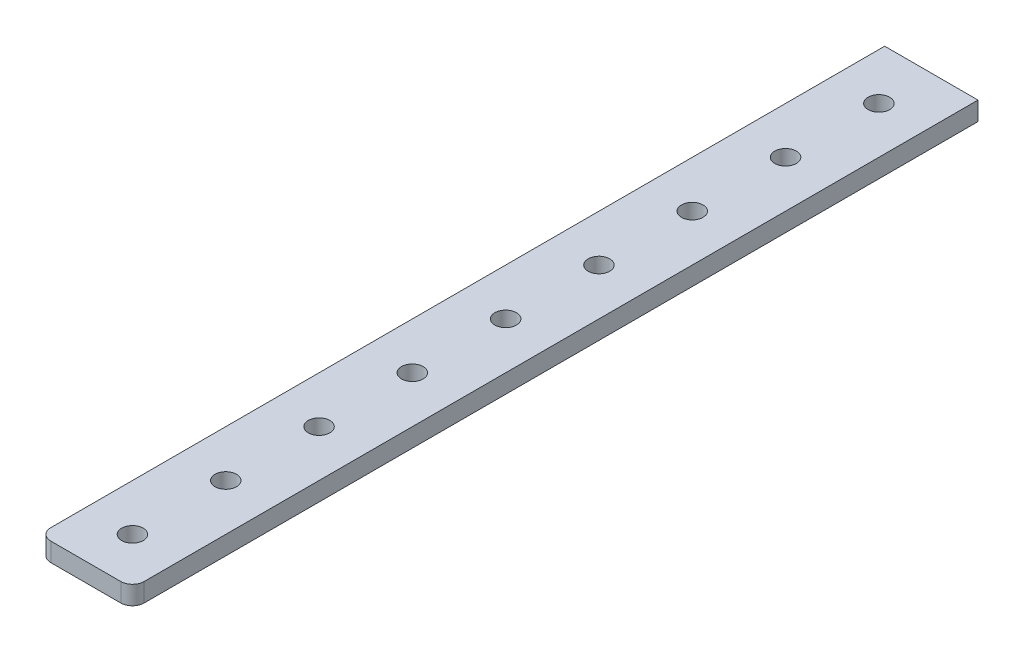
ISO-10303-21;
HEADER;
FILE_DESCRIPTION(('STEP AP214'),'2;1');
FILE_NAME('part.step','',(''),(''),'','','');
FILE_SCHEMA(('AUTOMOTIVE_DESIGN { 1 0 10303 214 1 1 1 1 }'));
ENDSEC;
DATA;
#1=APPLICATION_CONTEXT('core data for automotive mechanical design processes');
#2=APPLICATION_PROTOCOL_DEFINITION('international standard','automotive_design',2000,#1);
#3=PRODUCT_CONTEXT('',#1,'mechanical');
#4=PRODUCT('Part','Part','',(#3));
#5=PRODUCT_RELATED_PRODUCT_CATEGORY('part','',(#4));
#6=PRODUCT_DEFINITION_FORMATION('','',#4);
#7=PRODUCT_DEFINITION_CONTEXT('part definition',#1,'design');
#8=PRODUCT_DEFINITION('design','',#6,#7);
#9=PRODUCT_DEFINITION_SHAPE('','',#8);
#10=(LENGTH_UNIT() NAMED_UNIT(*) SI_UNIT(.MILLI.,.METRE.));
#11=(NAMED_UNIT(*) PLANE_ANGLE_UNIT() SI_UNIT($,.RADIAN.));
#12=(NAMED_UNIT(*) SI_UNIT($,.STERADIAN.) SOLID_ANGLE_UNIT());
#13=UNCERTAINTY_MEASURE_WITH_UNIT(LENGTH_MEASURE(1.E-05),#10,'distance_accuracy_value','');
#14=(GEOMETRIC_REPRESENTATION_CONTEXT(3) GLOBAL_UNCERTAINTY_ASSIGNED_CONTEXT((#13)) GLOBAL_UNIT_ASSIGNED_CONTEXT((#10,
#11,#12)) REPRESENTATION_CONTEXT('',''));
#15=CARTESIAN_POINT('',(0.,0.,0.));
#16=DIRECTION('',(0.,0.,1.));
#17=DIRECTION('',(1.,0.,0.));
#18=AXIS2_PLACEMENT_3D('',#15,#16,#17);
#19=CARTESIAN_POINT('',(0.,0.,0.));
#20=DIRECTION('',(0.,0.,1.));
#21=DIRECTION('',(1.,0.,0.));
#22=AXIS2_PLACEMENT_3D('',#19,#20,#21);
#23=PLANE('',#22);
#24=DIRECTION('',(1.,0.,0.));
#25=VECTOR('',#24,1.);
#26=CARTESIAN_POINT('',(-6.,0.,0.));
#27=LINE('',#26,#25);
#28=CARTESIAN_POINT('',(-6.,0.,0.));
#29=VERTEX_POINT('',#28);
#30=CARTESIAN_POINT('',(6.,0.,0.));
#31=VERTEX_POINT('',#30);
#32=EDGE_CURVE('E47',#29,#31,#27,.T.);
#33=ORIENTED_EDGE('',*,*,#32,.T.);
#34=DIRECTION('',(0.,1.,0.));
#35=VECTOR('',#34,1.);
#36=CARTESIAN_POINT('',(6.,0.,0.));
#37=LINE('',#36,#35);
#38=CARTESIAN_POINT('',(6.,3.2,0.));
#39=VERTEX_POINT('',#38);
#40=EDGE_CURVE('E62',#31,#39,#37,.T.);
#41=ORIENTED_EDGE('',*,*,#40,.T.);
#42=DIRECTION('',(-1.,0.,0.));
#43=VECTOR('',#42,1.);
#44=CARTESIAN_POINT('',(6.,3.2,0.));
#45=LINE('',#44,#43);
#46=CARTESIAN_POINT('',(-6.,3.2,0.));
#47=VERTEX_POINT('',#46);
#48=EDGE_CURVE('E152',#39,#47,#45,.T.);
#49=ORIENTED_EDGE('',*,*,#48,.T.);
#50=DIRECTION('',(0.,-1.,0.));
#51=VECTOR('',#50,1.);
#52=CARTESIAN_POINT('',(-6.,3.2,0.));
#53=LINE('',#52,#51);
#54=EDGE_CURVE('E158',#47,#29,#53,.T.);
#55=ORIENTED_EDGE('',*,*,#54,.T.);
#56=EDGE_LOOP('',(#33,#41,#49,#55));
#57=FACE_BOUND('',#56,.T.);
#58=ADVANCED_FACE('F39',(#57),#23,.T.);
#59=CARTESIAN_POINT('',(-8.,0.,0.));
#60=DIRECTION('',(0.,-1.,0.));
#61=DIRECTION('',(0.,0.,-1.));
#62=AXIS2_PLACEMENT_3D('',#59,#60,#61);
#63=PLANE('',#62);
#64=DIRECTION('',(1.,0.,0.));
#65=VECTOR('',#64,1.);
#66=CARTESIAN_POINT('',(0.,0.,-145.));
#67=LINE('',#66,#65);
#68=CARTESIAN_POINT('',(-8.,0.,-145.));
#69=VERTEX_POINT('',#68);
#70=CARTESIAN_POINT('',(8.,0.,-145.));
#71=VERTEX_POINT('',#70);
#72=EDGE_CURVE('E53',#69,#71,#67,.T.);
#73=ORIENTED_EDGE('',*,*,#72,.T.);
#74=DIRECTION('',(0.,0.,-1.));
#75=VECTOR('',#74,1.);
#76=CARTESIAN_POINT('',(8.,0.,-2.));
#77=LINE('',#76,#75);
#78=CARTESIAN_POINT('',(8.,0.,-2.));
#79=VERTEX_POINT('',#78);
#80=EDGE_CURVE('E206',#79,#71,#77,.T.);
#81=ORIENTED_EDGE('',*,*,#80,.F.);
#82=CARTESIAN_POINT('',(6.,0.,-2.));
#83=DIRECTION('',(0.,-1.,0.));
#84=DIRECTION('',(1.,0.,0.));
#85=AXIS2_PLACEMENT_3D('',#82,#83,#84);
#86=CIRCLE('',#85,2.);
#87=EDGE_CURVE('E160',#79,#31,#86,.T.);
#88=ORIENTED_EDGE('',*,*,#87,.T.);
#89=ORIENTED_EDGE('',*,*,#32,.F.);
#90=CARTESIAN_POINT('',(-6.,0.,-2.));
#91=DIRECTION('',(0.,-1.,0.));
#92=DIRECTION('',(0.,0.,1.));
#93=AXIS2_PLACEMENT_3D('',#90,#91,#92);
#94=CIRCLE('',#93,2.);
#95=CARTESIAN_POINT('',(-8.,0.,-2.));
#96=VERTEX_POINT('',#95);
#97=EDGE_CURVE('E167',#29,#96,#94,.T.);
#98=ORIENTED_EDGE('',*,*,#97,.T.);
#99=DIRECTION('',(0.,0.,-1.));
#100=VECTOR('',#99,1.);
#101=CARTESIAN_POINT('',(-8.,0.,-2.));
#102=LINE('',#101,#100);
#103=EDGE_CURVE('E209',#96,#69,#102,.T.);
#104=ORIENTED_EDGE('',*,*,#103,.T.);
#105=EDGE_LOOP('',(#73,#81,#88,#89,#98,#104));
#106=FACE_BOUND('',#105,.T.);
#107=CARTESIAN_POINT('',(0.,0.,-8.));
#108=DIRECTION('',(0.,-1.,0.));
#109=DIRECTION('',(1.,0.,0.));
#110=AXIS2_PLACEMENT_3D('',#107,#108,#109);
#111=CIRCLE('',#110,1.85);
#112=CARTESIAN_POINT('',(-1.85,0.,-8.));
#113=VERTEX_POINT('',#112);
#114=EDGE_CURVE('E150',#113,#113,#111,.T.);
#115=ORIENTED_EDGE('',*,*,#114,.F.);
#116=EDGE_LOOP('',(#115));
#117=FACE_BOUND('',#116,.T.);
#118=CARTESIAN_POINT('',(0.,0.,-24.));
#119=DIRECTION('',(0.,-1.,0.));
#120=DIRECTION('',(1.,0.,0.));
#121=AXIS2_PLACEMENT_3D('',#118,#119,#120);
#122=CIRCLE('',#121,1.85);
#123=CARTESIAN_POINT('',(-1.85,0.,-24.));
#124=VERTEX_POINT('',#123);
#125=EDGE_CURVE('E177',#124,#124,#122,.T.);
#126=ORIENTED_EDGE('',*,*,#125,.F.);
#127=EDGE_LOOP('',(#126));
#128=FACE_BOUND('',#127,.T.);
#129=CARTESIAN_POINT('',(0.,0.,-40.));
#130=DIRECTION('',(0.,-1.,0.));
#131=DIRECTION('',(1.,0.,0.));
#132=AXIS2_PLACEMENT_3D('',#129,#130,#131);
#133=CIRCLE('',#132,1.85);
#134=CARTESIAN_POINT('',(-1.85,0.,-40.));
#135=VERTEX_POINT('',#134);
#136=EDGE_CURVE('E164',#135,#135,#133,.T.);
#137=ORIENTED_EDGE('',*,*,#136,.F.);
#138=EDGE_LOOP('',(#137));
#139=FACE_BOUND('',#138,.T.);
#140=CARTESIAN_POINT('',(0.,0.,-56.));
#141=DIRECTION('',(0.,-1.,0.));
#142=DIRECTION('',(1.,0.,0.));
#143=AXIS2_PLACEMENT_3D('',#140,#141,#142);
#144=CIRCLE('',#143,1.85);
#145=CARTESIAN_POINT('',(-1.85,0.,-56.));
#146=VERTEX_POINT('',#145);
#147=EDGE_CURVE('E161',#146,#146,#144,.T.);
#148=ORIENTED_EDGE('',*,*,#147,.F.);
#149=EDGE_LOOP('',(#148));
#150=FACE_BOUND('',#149,.T.);
#151=CARTESIAN_POINT('',(0.,0.,-72.));
#152=DIRECTION('',(0.,-1.,0.));
#153=DIRECTION('',(1.,0.,0.));
#154=AXIS2_PLACEMENT_3D('',#151,#152,#153);
#155=CIRCLE('',#154,1.85);
#156=CARTESIAN_POINT('',(-1.85,0.,-72.));
#157=VERTEX_POINT('',#156);
#158=EDGE_CURVE('E156',#157,#157,#155,.T.);
#159=ORIENTED_EDGE('',*,*,#158,.F.);
#160=EDGE_LOOP('',(#159));
#161=FACE_BOUND('',#160,.T.);
#162=CARTESIAN_POINT('',(0.,0.,-88.));
#163=DIRECTION('',(0.,-1.,0.));
#164=DIRECTION('',(1.,0.,0.));
#165=AXIS2_PLACEMENT_3D('',#162,#163,#164);
#166=CIRCLE('',#165,1.85);
#167=CARTESIAN_POINT('',(-1.85,0.,-88.));
#168=VERTEX_POINT('',#167);
#169=EDGE_CURVE('E153',#168,#168,#166,.T.);
#170=ORIENTED_EDGE('',*,*,#169,.F.);
#171=EDGE_LOOP('',(#170));
#172=FACE_BOUND('',#171,.T.);
#173=CARTESIAN_POINT('',(0.,0.,-104.));
#174=DIRECTION('',(0.,-1.,0.));
#175=DIRECTION('',(1.,0.,0.));
#176=AXIS2_PLACEMENT_3D('',#173,#174,#175);
#177=CIRCLE('',#176,1.85);
#178=CARTESIAN_POINT('',(-1.85,0.,-104.));
#179=VERTEX_POINT('',#178);
#180=EDGE_CURVE('E157',#179,#179,#177,.T.);
#181=ORIENTED_EDGE('',*,*,#180,.F.);
#182=EDGE_LOOP('',(#181));
#183=FACE_BOUND('',#182,.T.);
#184=CARTESIAN_POINT('',(0.,0.,-120.));
#185=DIRECTION('',(0.,-1.,0.));
#186=DIRECTION('',(1.,0.,0.));
#187=AXIS2_PLACEMENT_3D('',#184,#185,#186);
#188=CIRCLE('',#187,1.85);
#189=CARTESIAN_POINT('',(-1.85,0.,-120.));
#190=VERTEX_POINT('',#189);
#191=EDGE_CURVE('E173',#190,#190,#188,.T.);
#192=ORIENTED_EDGE('',*,*,#191,.F.);
#193=EDGE_LOOP('',(#192));
#194=FACE_BOUND('',#193,.T.);
#195=CARTESIAN_POINT('',(0.,0.,-136.));
#196=DIRECTION('',(0.,-1.,0.));
#197=DIRECTION('',(1.,0.,0.));
#198=AXIS2_PLACEMENT_3D('',#195,#196,#197);
#199=CIRCLE('',#198,1.85);
#200=CARTESIAN_POINT('',(-1.85,0.,-136.));
#201=VERTEX_POINT('',#200);
#202=EDGE_CURVE('E170',#201,#201,#199,.T.);
#203=ORIENTED_EDGE('',*,*,#202,.F.);
#204=EDGE_LOOP('',(#203));
#205=FACE_BOUND('',#204,.T.);
#206=ADVANCED_FACE('F41',(#106,#117,#128,#139,#150,#161,#172,#183,#194,#205),#63,.T.);
#207=CARTESIAN_POINT('',(8.,0.,0.));
#208=DIRECTION('',(1.,0.,0.));
#209=DIRECTION('',(0.,0.,-1.));
#210=AXIS2_PLACEMENT_3D('',#207,#208,#209);
#211=PLANE('',#210);
#212=DIRECTION('',(0.,-1.,0.));
#213=VECTOR('',#212,1.);
#214=CARTESIAN_POINT('',(8.,0.,-145.));
#215=LINE('',#214,#213);
#216=CARTESIAN_POINT('',(8.,3.2,-145.));
#217=VERTEX_POINT('',#216);
#218=EDGE_CURVE('E203',#217,#71,#215,.T.);
#219=ORIENTED_EDGE('',*,*,#218,.F.);
#220=DIRECTION('',(0.,0.,-1.));
#221=VECTOR('',#220,1.);
#222=CARTESIAN_POINT('',(8.,3.2,-2.));
#223=LINE('',#222,#221);
#224=CARTESIAN_POINT('',(8.,3.2,-2.));
#225=VERTEX_POINT('',#224);
#226=EDGE_CURVE('E139',#225,#217,#223,.T.);
#227=ORIENTED_EDGE('',*,*,#226,.F.);
#228=DIRECTION('',(0.,1.,0.));
#229=VECTOR('',#228,1.);
#230=CARTESIAN_POINT('',(8.,0.,-2.));
#231=LINE('',#230,#229);
#232=EDGE_CURVE('E174',#79,#225,#231,.T.);
#233=ORIENTED_EDGE('',*,*,#232,.F.);
#234=ORIENTED_EDGE('',*,*,#80,.T.);
#235=EDGE_LOOP('',(#219,#227,#233,#234));
#236=FACE_BOUND('',#235,.T.);
#237=ADVANCED_FACE('F226',(#236),#211,.T.);
#238=CARTESIAN_POINT('',(8.,3.2,0.));
#239=DIRECTION('',(0.,1.,0.));
#240=DIRECTION('',(0.,0.,1.));
#241=AXIS2_PLACEMENT_3D('',#238,#239,#240);
#242=PLANE('',#241);
#243=DIRECTION('',(1.,0.,0.));
#244=VECTOR('',#243,1.);
#245=CARTESIAN_POINT('',(0.,3.2,-145.));
#246=LINE('',#245,#244);
#247=CARTESIAN_POINT('',(-8.,3.2,-145.));
#248=VERTEX_POINT('',#247);
#249=EDGE_CURVE('E327',#248,#217,#246,.T.);
#250=ORIENTED_EDGE('',*,*,#249,.F.);
#251=DIRECTION('',(0.,0.,-1.));
#252=VECTOR('',#251,1.);
#253=CARTESIAN_POINT('',(-8.,3.2,-2.));
#254=LINE('',#253,#252);
#255=CARTESIAN_POINT('',(-8.,3.2,-2.));
#256=VERTEX_POINT('',#255);
#257=EDGE_CURVE('E190',#256,#248,#254,.T.);
#258=ORIENTED_EDGE('',*,*,#257,.F.);
#259=CARTESIAN_POINT('',(-6.,3.2,-2.));
#260=DIRECTION('',(0.,1.,0.));
#261=DIRECTION('',(-1.,0.,0.));
#262=AXIS2_PLACEMENT_3D('',#259,#260,#261);
#263=CIRCLE('',#262,2.);
#264=EDGE_CURVE('E180',#256,#47,#263,.T.);
#265=ORIENTED_EDGE('',*,*,#264,.T.);
#266=ORIENTED_EDGE('',*,*,#48,.F.);
#267=CARTESIAN_POINT('',(6.,3.2,-2.));
#268=DIRECTION('',(0.,1.,0.));
#269=DIRECTION('',(0.,0.,1.));
#270=AXIS2_PLACEMENT_3D('',#267,#268,#269);
#271=CIRCLE('',#270,2.);
#272=EDGE_CURVE('E143',#39,#225,#271,.T.);
#273=ORIENTED_EDGE('',*,*,#272,.T.);
#274=ORIENTED_EDGE('',*,*,#226,.T.);
#275=EDGE_LOOP('',(#250,#258,#265,#266,#273,#274));
#276=FACE_BOUND('',#275,.T.);
#277=CARTESIAN_POINT('',(0.,3.2,-8.));
#278=DIRECTION('',(0.,-1.,0.));
#279=DIRECTION('',(1.,0.,0.));
#280=AXIS2_PLACEMENT_3D('',#277,#278,#279);
#281=CIRCLE('',#280,1.85);
#282=CARTESIAN_POINT('',(-1.85,3.2,-8.));
#283=VERTEX_POINT('',#282);
#284=EDGE_CURVE('E136',#283,#283,#281,.T.);
#285=ORIENTED_EDGE('',*,*,#284,.T.);
#286=EDGE_LOOP('',(#285));
#287=FACE_BOUND('',#286,.T.);
#288=CARTESIAN_POINT('',(0.,3.2,-24.));
#289=DIRECTION('',(0.,-1.,0.));
#290=DIRECTION('',(1.,0.,0.));
#291=AXIS2_PLACEMENT_3D('',#288,#289,#290);
#292=CIRCLE('',#291,1.85);
#293=CARTESIAN_POINT('',(-1.85,3.2,-24.));
#294=VERTEX_POINT('',#293);
#295=EDGE_CURVE('E140',#294,#294,#292,.T.);
#296=ORIENTED_EDGE('',*,*,#295,.T.);
#297=EDGE_LOOP('',(#296));
#298=FACE_BOUND('',#297,.T.);
#299=CARTESIAN_POINT('',(0.,3.2,-40.));
#300=DIRECTION('',(0.,-1.,0.));
#301=DIRECTION('',(1.,0.,0.));
#302=AXIS2_PLACEMENT_3D('',#299,#300,#301);
#303=CIRCLE('',#302,1.85);
#304=CARTESIAN_POINT('',(-1.85,3.2,-40.));
#305=VERTEX_POINT('',#304);
#306=EDGE_CURVE('E146',#305,#305,#303,.T.);
#307=ORIENTED_EDGE('',*,*,#306,.T.);
#308=EDGE_LOOP('',(#307));
#309=FACE_BOUND('',#308,.T.);
#310=CARTESIAN_POINT('',(0.,3.2,-56.));
#311=DIRECTION('',(0.,-1.,0.));
#312=DIRECTION('',(1.,0.,0.));
#313=AXIS2_PLACEMENT_3D('',#310,#311,#312);
#314=CIRCLE('',#313,1.85);
#315=CARTESIAN_POINT('',(-1.85,3.2,-56.));
#316=VERTEX_POINT('',#315);
#317=EDGE_CURVE('E191',#316,#316,#314,.T.);
#318=ORIENTED_EDGE('',*,*,#317,.T.);
#319=EDGE_LOOP('',(#318));
#320=FACE_BOUND('',#319,.T.);
#321=CARTESIAN_POINT('',(0.,3.2,-72.));
#322=DIRECTION('',(0.,-1.,0.));
#323=DIRECTION('',(1.,0.,0.));
#324=AXIS2_PLACEMENT_3D('',#321,#322,#323);
#325=CIRCLE('',#324,1.85);
#326=CARTESIAN_POINT('',(-1.85,3.2,-72.));
#327=VERTEX_POINT('',#326);
#328=EDGE_CURVE('E184',#327,#327,#325,.T.);
#329=ORIENTED_EDGE('',*,*,#328,.T.);
#330=EDGE_LOOP('',(#329));
#331=FACE_BOUND('',#330,.T.);
#332=CARTESIAN_POINT('',(0.,3.2,-88.));
#333=DIRECTION('',(0.,-1.,0.));
#334=DIRECTION('',(1.,0.,0.));
#335=AXIS2_PLACEMENT_3D('',#332,#333,#334);
#336=CIRCLE('',#335,1.85);
#337=CARTESIAN_POINT('',(-1.85,3.2,-88.));
#338=VERTEX_POINT('',#337);
#339=EDGE_CURVE('E181',#338,#338,#336,.T.);
#340=ORIENTED_EDGE('',*,*,#339,.T.);
#341=EDGE_LOOP('',(#340));
#342=FACE_BOUND('',#341,.T.);
#343=CARTESIAN_POINT('',(0.,3.2,-104.));
#344=DIRECTION('',(0.,-1.,0.));
#345=DIRECTION('',(1.,0.,0.));
#346=AXIS2_PLACEMENT_3D('',#343,#344,#345);
#347=CIRCLE('',#346,1.85);
#348=CARTESIAN_POINT('',(-1.85,3.2,-104.));
#349=VERTEX_POINT('',#348);
#350=EDGE_CURVE('E185',#349,#349,#347,.T.);
#351=ORIENTED_EDGE('',*,*,#350,.T.);
#352=EDGE_LOOP('',(#351));
#353=FACE_BOUND('',#352,.T.);
#354=CARTESIAN_POINT('',(0.,3.2,-120.));
#355=DIRECTION('',(0.,-1.,0.));
#356=DIRECTION('',(1.,0.,0.));
#357=AXIS2_PLACEMENT_3D('',#354,#355,#356);
#358=CIRCLE('',#357,1.85);
#359=CARTESIAN_POINT('',(-1.85,3.2,-120.));
#360=VERTEX_POINT('',#359);
#361=EDGE_CURVE('E189',#360,#360,#358,.T.);
#362=ORIENTED_EDGE('',*,*,#361,.T.);
#363=EDGE_LOOP('',(#362));
#364=FACE_BOUND('',#363,.T.);
#365=CARTESIAN_POINT('',(0.,3.2,-136.));
#366=DIRECTION('',(0.,-1.,0.));
#367=DIRECTION('',(1.,0.,0.));
#368=AXIS2_PLACEMENT_3D('',#365,#366,#367);
#369=CIRCLE('',#368,1.85);
#370=CARTESIAN_POINT('',(-1.85,3.2,-136.));
#371=VERTEX_POINT('',#370);
#372=EDGE_CURVE('E186',#371,#371,#369,.T.);
#373=ORIENTED_EDGE('',*,*,#372,.T.);
#374=EDGE_LOOP('',(#373));
#375=FACE_BOUND('',#374,.T.);
#376=ADVANCED_FACE('F235',(#276,#287,#298,#309,#320,#331,#342,#353,#364,#375),#242,.T.);
#377=CARTESIAN_POINT('',(-8.,3.2,0.));
#378=DIRECTION('',(-1.,0.,0.));
#379=DIRECTION('',(0.,0.,1.));
#380=AXIS2_PLACEMENT_3D('',#377,#378,#379);
#381=PLANE('',#380);
#382=DIRECTION('',(0.,1.,0.));
#383=VECTOR('',#382,1.);
#384=CARTESIAN_POINT('',(-8.,3.2,-145.));
#385=LINE('',#384,#383);
#386=EDGE_CURVE('E11',#69,#248,#385,.T.);
#387=ORIENTED_EDGE('',*,*,#386,.F.);
#388=ORIENTED_EDGE('',*,*,#103,.F.);
#389=DIRECTION('',(0.,-1.,0.));
#390=VECTOR('',#389,1.);
#391=CARTESIAN_POINT('',(-8.,3.2,-2.));
#392=LINE('',#391,#390);
#393=EDGE_CURVE('E200',#256,#96,#392,.T.);
#394=ORIENTED_EDGE('',*,*,#393,.F.);
#395=ORIENTED_EDGE('',*,*,#257,.T.);
#396=EDGE_LOOP('',(#387,#388,#394,#395));
#397=FACE_BOUND('',#396,.T.);
#398=ADVANCED_FACE('F237',(#397),#381,.T.);
#399=CARTESIAN_POINT('',(0.,3.2,-8.));
#400=DIRECTION('',(0.,1.,0.));
#401=DIRECTION('',(1.,0.,0.));
#402=AXIS2_PLACEMENT_3D('',#399,#400,#401);
#403=CYLINDRICAL_SURFACE('',#402,1.85);
#404=ORIENTED_EDGE('',*,*,#114,.T.);
#405=EDGE_LOOP('',(#404));
#406=FACE_BOUND('',#405,.T.);
#407=ORIENTED_EDGE('',*,*,#284,.F.);
#408=EDGE_LOOP('',(#407));
#409=FACE_BOUND('',#408,.T.);
#410=ADVANCED_FACE('F137',(#406,#409),#403,.F.);
#411=CARTESIAN_POINT('',(0.,3.2,-24.));
#412=DIRECTION('',(0.,1.,0.));
#413=DIRECTION('',(1.,0.,0.));
#414=AXIS2_PLACEMENT_3D('',#411,#412,#413);
#415=CYLINDRICAL_SURFACE('',#414,1.85);
#416=ORIENTED_EDGE('',*,*,#125,.T.);
#417=EDGE_LOOP('',(#416));
#418=FACE_BOUND('',#417,.T.);
#419=ORIENTED_EDGE('',*,*,#295,.F.);
#420=EDGE_LOOP('',(#419));
#421=FACE_BOUND('',#420,.T.);
#422=ADVANCED_FACE('F268',(#418,#421),#415,.F.);
#423=CARTESIAN_POINT('',(0.,3.2,-40.));
#424=DIRECTION('',(0.,1.,0.));
#425=DIRECTION('',(1.,0.,0.));
#426=AXIS2_PLACEMENT_3D('',#423,#424,#425);
#427=CYLINDRICAL_SURFACE('',#426,1.85);
#428=ORIENTED_EDGE('',*,*,#136,.T.);
#429=EDGE_LOOP('',(#428));
#430=FACE_BOUND('',#429,.T.);
#431=ORIENTED_EDGE('',*,*,#306,.F.);
#432=EDGE_LOOP('',(#431));
#433=FACE_BOUND('',#432,.T.);
#434=ADVANCED_FACE('F265',(#430,#433),#427,.F.);
#435=CARTESIAN_POINT('',(0.,3.2,-56.));
#436=DIRECTION('',(0.,1.,0.));
#437=DIRECTION('',(1.,0.,0.));
#438=AXIS2_PLACEMENT_3D('',#435,#436,#437);
#439=CYLINDRICAL_SURFACE('',#438,1.85);
#440=ORIENTED_EDGE('',*,*,#147,.T.);
#441=EDGE_LOOP('',(#440));
#442=FACE_BOUND('',#441,.T.);
#443=ORIENTED_EDGE('',*,*,#317,.F.);
#444=EDGE_LOOP('',(#443));
#445=FACE_BOUND('',#444,.T.);
#446=ADVANCED_FACE('F267',(#442,#445),#439,.F.);
#447=CARTESIAN_POINT('',(0.,3.2,-72.));
#448=DIRECTION('',(0.,1.,0.));
#449=DIRECTION('',(1.,0.,0.));
#450=AXIS2_PLACEMENT_3D('',#447,#448,#449);
#451=CYLINDRICAL_SURFACE('',#450,1.85);
#452=ORIENTED_EDGE('',*,*,#158,.T.);
#453=EDGE_LOOP('',(#452));
#454=FACE_BOUND('',#453,.T.);
#455=ORIENTED_EDGE('',*,*,#328,.F.);
#456=EDGE_LOOP('',(#455));
#457=FACE_BOUND('',#456,.T.);
#458=ADVANCED_FACE('F263',(#454,#457),#451,.F.);
#459=CARTESIAN_POINT('',(0.,3.2,-88.));
#460=DIRECTION('',(0.,1.,0.));
#461=DIRECTION('',(1.,0.,0.));
#462=AXIS2_PLACEMENT_3D('',#459,#460,#461);
#463=CYLINDRICAL_SURFACE('',#462,1.85);
#464=ORIENTED_EDGE('',*,*,#169,.T.);
#465=EDGE_LOOP('',(#464));
#466=FACE_BOUND('',#465,.T.);
#467=ORIENTED_EDGE('',*,*,#339,.F.);
#468=EDGE_LOOP('',(#467));
#469=FACE_BOUND('',#468,.T.);
#470=ADVANCED_FACE('F261',(#466,#469),#463,.F.);
#471=CARTESIAN_POINT('',(0.,3.2,-104.));
#472=DIRECTION('',(0.,1.,0.));
#473=DIRECTION('',(1.,0.,0.));
#474=AXIS2_PLACEMENT_3D('',#471,#472,#473);
#475=CYLINDRICAL_SURFACE('',#474,1.85);
#476=ORIENTED_EDGE('',*,*,#180,.T.);
#477=EDGE_LOOP('',(#476));
#478=FACE_BOUND('',#477,.T.);
#479=ORIENTED_EDGE('',*,*,#350,.F.);
#480=EDGE_LOOP('',(#479));
#481=FACE_BOUND('',#480,.T.);
#482=ADVANCED_FACE('F262',(#478,#481),#475,.F.);
#483=CARTESIAN_POINT('',(0.,3.2,-120.));
#484=DIRECTION('',(0.,1.,0.));
#485=DIRECTION('',(1.,0.,0.));
#486=AXIS2_PLACEMENT_3D('',#483,#484,#485);
#487=CYLINDRICAL_SURFACE('',#486,1.85);
#488=ORIENTED_EDGE('',*,*,#191,.T.);
#489=EDGE_LOOP('',(#488));
#490=FACE_BOUND('',#489,.T.);
#491=ORIENTED_EDGE('',*,*,#361,.F.);
#492=EDGE_LOOP('',(#491));
#493=FACE_BOUND('',#492,.T.);
#494=ADVANCED_FACE('F221',(#490,#493),#487,.F.);
#495=CARTESIAN_POINT('',(0.,3.2,-136.));
#496=DIRECTION('',(0.,1.,0.));
#497=DIRECTION('',(1.,0.,0.));
#498=AXIS2_PLACEMENT_3D('',#495,#496,#497);
#499=CYLINDRICAL_SURFACE('',#498,1.85);
#500=ORIENTED_EDGE('',*,*,#202,.T.);
#501=EDGE_LOOP('',(#500));
#502=FACE_BOUND('',#501,.T.);
#503=ORIENTED_EDGE('',*,*,#372,.F.);
#504=EDGE_LOOP('',(#503));
#505=FACE_BOUND('',#504,.T.);
#506=ADVANCED_FACE('F229',(#502,#505),#499,.F.);
#507=CARTESIAN_POINT('',(6.,-4.17152,-2.));
#508=DIRECTION('',(0.,-1.,0.));
#509=DIRECTION('',(0.,0.,1.));
#510=AXIS2_PLACEMENT_3D('',#507,#508,#509);
#511=CYLINDRICAL_SURFACE('',#510,2.);
#512=ORIENTED_EDGE('',*,*,#272,.F.);
#513=ORIENTED_EDGE('',*,*,#40,.F.);
#514=ORIENTED_EDGE('',*,*,#87,.F.);
#515=ORIENTED_EDGE('',*,*,#232,.T.);
#516=EDGE_LOOP('',(#512,#513,#514,#515));
#517=FACE_BOUND('',#516,.T.);
#518=ADVANCED_FACE('F232',(#517),#511,.T.);
#519=CARTESIAN_POINT('',(-6.,7.37152,-2.));
#520=DIRECTION('',(0.,1.,0.));
#521=DIRECTION('',(0.,0.,1.));
#522=AXIS2_PLACEMENT_3D('',#519,#520,#521);
#523=CYLINDRICAL_SURFACE('',#522,2.);
#524=ORIENTED_EDGE('',*,*,#97,.F.);
#525=ORIENTED_EDGE('',*,*,#54,.F.);
#526=ORIENTED_EDGE('',*,*,#264,.F.);
#527=ORIENTED_EDGE('',*,*,#393,.T.);
#528=EDGE_LOOP('',(#524,#525,#526,#527));
#529=FACE_BOUND('',#528,.T.);
#530=ADVANCED_FACE('F309',(#529),#523,.T.);
#531=CARTESIAN_POINT('',(0.,0.,-145.));
#532=DIRECTION('',(0.,0.,1.));
#533=DIRECTION('',(1.,0.,0.));
#534=AXIS2_PLACEMENT_3D('',#531,#532,#533);
#535=PLANE('',#534);
#536=ORIENTED_EDGE('',*,*,#218,.T.);
#537=ORIENTED_EDGE('',*,*,#72,.F.);
#538=ORIENTED_EDGE('',*,*,#386,.T.);
#539=ORIENTED_EDGE('',*,*,#249,.T.);
#540=EDGE_LOOP('',(#536,#537,#538,#539));
#541=FACE_BOUND('',#540,.T.);
#542=ADVANCED_FACE('F313',(#541),#535,.F.);
#543=CLOSED_SHELL('',(#58,#206,#237,#376,#398,#410,#422,#434,#446,#458,#470,#482,#494,#506,#518,
#530,#542));
#544=MANIFOLD_SOLID_BREP('B2',#543);
#545=ADVANCED_BREP_SHAPE_REPRESENTATION('',(#18,#544),#14);
#546=SHAPE_DEFINITION_REPRESENTATION(#9,#545);
ENDSEC;
END-ISO-10303-21;
